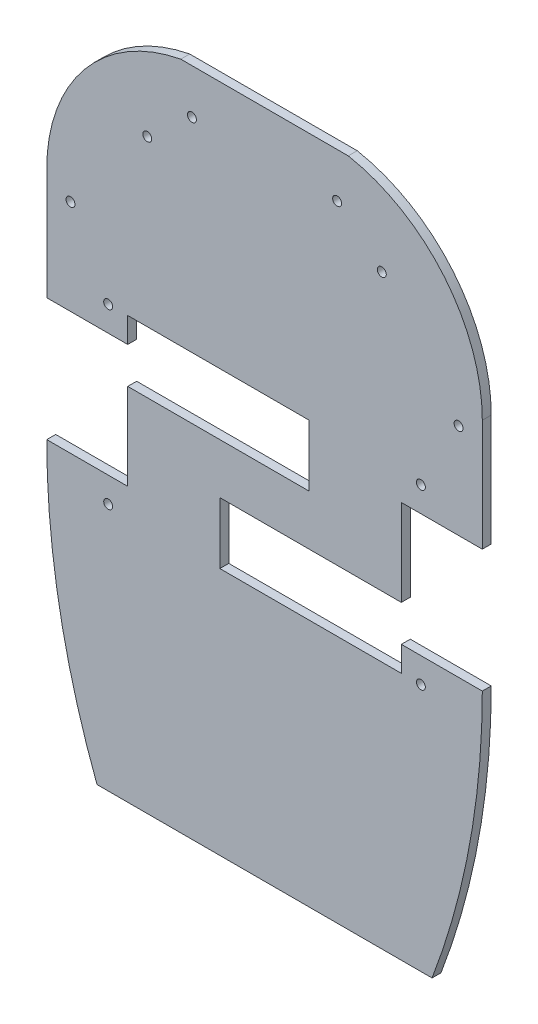
ISO-10303-21;
HEADER;
FILE_DESCRIPTION(('STEP AP214'),'2;1');
FILE_NAME('part.step','',(''),(''),'','','');
FILE_SCHEMA(('AUTOMOTIVE_DESIGN { 1 0 10303 214 1 1 1 1 }'));
ENDSEC;
DATA;
#1=APPLICATION_CONTEXT('core data for automotive mechanical design processes');
#2=APPLICATION_PROTOCOL_DEFINITION('international standard','automotive_design',2000,#1);
#3=PRODUCT_CONTEXT('',#1,'mechanical');
#4=PRODUCT('Part','Part','',(#3));
#5=PRODUCT_RELATED_PRODUCT_CATEGORY('part','',(#4));
#6=PRODUCT_DEFINITION_FORMATION('','',#4);
#7=PRODUCT_DEFINITION_CONTEXT('part definition',#1,'design');
#8=PRODUCT_DEFINITION('design','',#6,#7);
#9=PRODUCT_DEFINITION_SHAPE('','',#8);
#10=(LENGTH_UNIT() NAMED_UNIT(*) SI_UNIT(.MILLI.,.METRE.));
#11=(NAMED_UNIT(*) PLANE_ANGLE_UNIT() SI_UNIT($,.RADIAN.));
#12=(NAMED_UNIT(*) SI_UNIT($,.STERADIAN.) SOLID_ANGLE_UNIT());
#13=UNCERTAINTY_MEASURE_WITH_UNIT(LENGTH_MEASURE(1.E-05),#10,'distance_accuracy_value','');
#14=(GEOMETRIC_REPRESENTATION_CONTEXT(3) GLOBAL_UNCERTAINTY_ASSIGNED_CONTEXT((#13)) GLOBAL_UNIT_ASSIGNED_CONTEXT((#10,
#11,#12)) REPRESENTATION_CONTEXT('',''));
#15=CARTESIAN_POINT('',(0.,0.,0.));
#16=DIRECTION('',(0.,0.,1.));
#17=DIRECTION('',(1.,0.,0.));
#18=AXIS2_PLACEMENT_3D('',#15,#16,#17);
#19=CARTESIAN_POINT('',(-59.8888888888894,49.,1.6));
#20=DIRECTION('',(0.,0.,-1.));
#21=DIRECTION('',(-1.,0.,0.));
#22=AXIS2_PLACEMENT_3D('',#19,#20,#21);
#23=PLANE('',#22);
#24=CARTESIAN_POINT('',(26.,112.,1.6));
#25=DIRECTION('',(0.,0.,1.));
#26=DIRECTION('',(-1.,0.,0.));
#27=AXIS2_PLACEMENT_3D('',#24,#25,#26);
#28=CIRCLE('',#27,0.799999999999994);
#29=CARTESIAN_POINT('',(25.2,112.,1.6));
#30=VERTEX_POINT('',#29);
#31=EDGE_CURVE('E480',#30,#30,#28,.T.);
#32=ORIENTED_EDGE('',*,*,#31,.F.);
#33=EDGE_LOOP('',(#32));
#34=FACE_BOUND('',#33,.T.);
#35=CARTESIAN_POINT('',(18.,105.,1.6));
#36=DIRECTION('',(0.,0.,1.));
#37=DIRECTION('',(-1.,0.,0.));
#38=AXIS2_PLACEMENT_3D('',#35,#36,#37);
#39=CIRCLE('',#38,0.799999999999994);
#40=CARTESIAN_POINT('',(17.2,105.,1.6));
#41=VERTEX_POINT('',#40);
#42=EDGE_CURVE('E468',#41,#41,#39,.T.);
#43=ORIENTED_EDGE('',*,*,#42,.F.);
#44=EDGE_LOOP('',(#43));
#45=FACE_BOUND('',#44,.T.);
#46=CARTESIAN_POINT('',(4.25,88.,1.6));
#47=DIRECTION('',(0.,0.,1.));
#48=DIRECTION('',(-1.,0.,0.));
#49=AXIS2_PLACEMENT_3D('',#46,#47,#48);
#50=CIRCLE('',#49,0.799999999999992);
#51=CARTESIAN_POINT('',(3.45000000000001,88.,1.6));
#52=VERTEX_POINT('',#51);
#53=EDGE_CURVE('E456',#52,#52,#50,.T.);
#54=ORIENTED_EDGE('',*,*,#53,.F.);
#55=EDGE_LOOP('',(#54));
#56=FACE_BOUND('',#55,.T.);
#57=CARTESIAN_POINT('',(11.,44.5,1.6));
#58=DIRECTION('',(0.,0.,1.));
#59=DIRECTION('',(-1.,0.,0.));
#60=AXIS2_PLACEMENT_3D('',#57,#58,#59);
#61=CIRCLE('',#60,0.799999999999996);
#62=CARTESIAN_POINT('',(10.2,44.5,1.6));
#63=VERTEX_POINT('',#62);
#64=EDGE_CURVE('E444',#63,#63,#61,.T.);
#65=ORIENTED_EDGE('',*,*,#64,.F.);
#66=EDGE_LOOP('',(#65));
#67=FACE_BOUND('',#66,.T.);
#68=CARTESIAN_POINT('',(67.,75.5,1.6));
#69=DIRECTION('',(0.,0.,1.));
#70=DIRECTION('',(1.,0.,0.));
#71=AXIS2_PLACEMENT_3D('',#68,#69,#70);
#72=CIRCLE('',#71,0.799999999999994);
#73=CARTESIAN_POINT('',(67.8,75.5,1.6));
#74=VERTEX_POINT('',#73);
#75=EDGE_CURVE('E197',#74,#74,#72,.T.);
#76=ORIENTED_EDGE('',*,*,#75,.F.);
#77=EDGE_LOOP('',(#76));
#78=FACE_BOUND('',#77,.T.);
#79=DIRECTION('',(1.,0.,0.));
#80=VECTOR('',#79,1.);
#81=CARTESIAN_POINT('',(39.,0.,1.6));
#82=LINE('',#81,#80);
#83=CARTESIAN_POINT('',(9.00000000000001,0.,1.6));
#84=VERTEX_POINT('',#83);
#85=CARTESIAN_POINT('',(69.,0.,1.6));
#86=VERTEX_POINT('',#85);
#87=EDGE_CURVE('E45',#84,#86,#82,.T.);
#88=ORIENTED_EDGE('',*,*,#87,.T.);
#89=CARTESIAN_POINT('',(-59.8888888888894,49.,1.6));
#90=DIRECTION('',(0.,0.,1.));
#91=DIRECTION('',(-1.,0.,0.));
#92=AXIS2_PLACEMENT_3D('',#89,#90,#91);
#93=CIRCLE('',#92,137.888888888889);
#94=CARTESIAN_POINT('',(78.,49.,1.6));
#95=VERTEX_POINT('',#94);
#96=EDGE_CURVE('E199',#86,#95,#93,.T.);
#97=ORIENTED_EDGE('',*,*,#96,.T.);
#98=DIRECTION('',(-1.,0.,0.));
#99=VECTOR('',#98,1.);
#100=CARTESIAN_POINT('',(63.5,49.,1.6));
#101=LINE('',#100,#99);
#102=CARTESIAN_POINT('',(63.5,49.,1.6));
#103=VERTEX_POINT('',#102);
#104=EDGE_CURVE('E201',#95,#103,#101,.T.);
#105=ORIENTED_EDGE('',*,*,#104,.T.);
#106=DIRECTION('',(0.,-1.,0.));
#107=VECTOR('',#106,1.);
#108=CARTESIAN_POINT('',(63.5,49.,1.6));
#109=LINE('',#108,#107);
#110=CARTESIAN_POINT('',(63.5,44.5,1.6));
#111=VERTEX_POINT('',#110);
#112=EDGE_CURVE('E210',#103,#111,#109,.T.);
#113=ORIENTED_EDGE('',*,*,#112,.T.);
#114=DIRECTION('',(-1.,0.,0.));
#115=VECTOR('',#114,1.);
#116=CARTESIAN_POINT('',(63.5,44.5,1.6));
#117=LINE('',#116,#115);
#118=CARTESIAN_POINT('',(31.,44.5,1.6));
#119=VERTEX_POINT('',#118);
#120=EDGE_CURVE('E212',#111,#119,#117,.T.);
#121=ORIENTED_EDGE('',*,*,#120,.T.);
#122=DIRECTION('',(0.,1.,0.));
#123=VECTOR('',#122,1.);
#124=CARTESIAN_POINT('',(31.,44.5,1.6));
#125=LINE('',#124,#123);
#126=CARTESIAN_POINT('',(31.,55.5,1.6));
#127=VERTEX_POINT('',#126);
#128=EDGE_CURVE('E214',#119,#127,#125,.T.);
#129=ORIENTED_EDGE('',*,*,#128,.T.);
#130=DIRECTION('',(1.,0.,0.));
#131=VECTOR('',#130,1.);
#132=CARTESIAN_POINT('',(31.,55.5,1.6));
#133=LINE('',#132,#131);
#134=CARTESIAN_POINT('',(63.5,55.5,1.6));
#135=VERTEX_POINT('',#134);
#136=EDGE_CURVE('E216',#127,#135,#133,.T.);
#137=ORIENTED_EDGE('',*,*,#136,.T.);
#138=DIRECTION('',(0.,1.,0.));
#139=VECTOR('',#138,1.);
#140=CARTESIAN_POINT('',(63.5,71.,1.6));
#141=LINE('',#140,#139);
#142=CARTESIAN_POINT('',(63.5,71.,1.6));
#143=VERTEX_POINT('',#142);
#144=EDGE_CURVE('E218',#135,#143,#141,.T.);
#145=ORIENTED_EDGE('',*,*,#144,.T.);
#146=DIRECTION('',(1.,0.,0.));
#147=VECTOR('',#146,1.);
#148=CARTESIAN_POINT('',(78.,71.,1.6));
#149=LINE('',#148,#147);
#150=CARTESIAN_POINT('',(78.,71.,1.6));
#151=VERTEX_POINT('',#150);
#152=EDGE_CURVE('E220',#143,#151,#149,.T.);
#153=ORIENTED_EDGE('',*,*,#152,.T.);
#154=DIRECTION('',(0.,1.,0.));
#155=VECTOR('',#154,1.);
#156=CARTESIAN_POINT('',(78.,91.,1.6));
#157=LINE('',#156,#155);
#158=CARTESIAN_POINT('',(78.,91.,1.6));
#159=VERTEX_POINT('',#158);
#160=EDGE_CURVE('E222',#151,#159,#157,.T.);
#161=ORIENTED_EDGE('',*,*,#160,.T.);
#162=CARTESIAN_POINT('',(48.4791666666667,91.,1.6));
#163=DIRECTION('',(0.,0.,1.));
#164=DIRECTION('',(1.,0.,0.));
#165=AXIS2_PLACEMENT_3D('',#162,#163,#164);
#166=CIRCLE('',#165,29.5208333333333);
#167=CARTESIAN_POINT('',(54.,120.,1.6));
#168=VERTEX_POINT('',#167);
#169=EDGE_CURVE('E224',#159,#168,#166,.T.);
#170=ORIENTED_EDGE('',*,*,#169,.T.);
#171=DIRECTION('',(-1.,0.,0.));
#172=VECTOR('',#171,1.);
#173=CARTESIAN_POINT('',(39.,120.,1.6));
#174=LINE('',#173,#172);
#175=CARTESIAN_POINT('',(24.,120.,1.6));
#176=VERTEX_POINT('',#175);
#177=EDGE_CURVE('E226',#168,#176,#174,.T.);
#178=ORIENTED_EDGE('',*,*,#177,.T.);
#179=CARTESIAN_POINT('',(29.5208333333333,91.,1.6));
#180=DIRECTION('',(0.,0.,1.));
#181=DIRECTION('',(-1.,0.,0.));
#182=AXIS2_PLACEMENT_3D('',#179,#180,#181);
#183=CIRCLE('',#182,29.5208333333333);
#184=CARTESIAN_POINT('',(0.,91.,1.6));
#185=VERTEX_POINT('',#184);
#186=EDGE_CURVE('E228',#176,#185,#183,.T.);
#187=ORIENTED_EDGE('',*,*,#186,.T.);
#188=DIRECTION('',(0.,-1.,0.));
#189=VECTOR('',#188,1.);
#190=CARTESIAN_POINT('',(0.,91.,1.6));
#191=LINE('',#190,#189);
#192=CARTESIAN_POINT('',(0.,71.,1.6));
#193=VERTEX_POINT('',#192);
#194=EDGE_CURVE('E230',#185,#193,#191,.T.);
#195=ORIENTED_EDGE('',*,*,#194,.T.);
#196=DIRECTION('',(1.,0.,0.));
#197=VECTOR('',#196,1.);
#198=CARTESIAN_POINT('',(0.,71.,1.6));
#199=LINE('',#198,#197);
#200=CARTESIAN_POINT('',(14.5,71.,1.6));
#201=VERTEX_POINT('',#200);
#202=EDGE_CURVE('E232',#193,#201,#199,.T.);
#203=ORIENTED_EDGE('',*,*,#202,.T.);
#204=DIRECTION('',(0.,1.,0.));
#205=VECTOR('',#204,1.);
#206=CARTESIAN_POINT('',(14.5,71.,1.6));
#207=LINE('',#206,#205);
#208=CARTESIAN_POINT('',(14.5,75.5,1.6));
#209=VERTEX_POINT('',#208);
#210=EDGE_CURVE('E234',#201,#209,#207,.T.);
#211=ORIENTED_EDGE('',*,*,#210,.T.);
#212=DIRECTION('',(1.,0.,0.));
#213=VECTOR('',#212,1.);
#214=CARTESIAN_POINT('',(14.5,75.5,1.6));
#215=LINE('',#214,#213);
#216=CARTESIAN_POINT('',(47.,75.5,1.6));
#217=VERTEX_POINT('',#216);
#218=EDGE_CURVE('E236',#209,#217,#215,.T.);
#219=ORIENTED_EDGE('',*,*,#218,.T.);
#220=DIRECTION('',(0.,-1.,0.));
#221=VECTOR('',#220,1.);
#222=CARTESIAN_POINT('',(47.,75.5,1.6));
#223=LINE('',#222,#221);
#224=CARTESIAN_POINT('',(47.,64.5,1.6));
#225=VERTEX_POINT('',#224);
#226=EDGE_CURVE('E238',#217,#225,#223,.T.);
#227=ORIENTED_EDGE('',*,*,#226,.T.);
#228=DIRECTION('',(-1.,0.,0.));
#229=VECTOR('',#228,1.);
#230=CARTESIAN_POINT('',(47.,64.5,1.6));
#231=LINE('',#230,#229);
#232=CARTESIAN_POINT('',(14.5,64.5,1.6));
#233=VERTEX_POINT('',#232);
#234=EDGE_CURVE('E240',#225,#233,#231,.T.);
#235=ORIENTED_EDGE('',*,*,#234,.T.);
#236=DIRECTION('',(0.,-1.,0.));
#237=VECTOR('',#236,1.);
#238=CARTESIAN_POINT('',(14.5,64.5,1.6));
#239=LINE('',#238,#237);
#240=CARTESIAN_POINT('',(14.5,49.,1.6));
#241=VERTEX_POINT('',#240);
#242=EDGE_CURVE('E242',#233,#241,#239,.T.);
#243=ORIENTED_EDGE('',*,*,#242,.T.);
#244=DIRECTION('',(-1.,0.,0.));
#245=VECTOR('',#244,1.);
#246=CARTESIAN_POINT('',(14.5,49.,1.6));
#247=LINE('',#246,#245);
#248=CARTESIAN_POINT('',(0.,49.,1.6));
#249=VERTEX_POINT('',#248);
#250=EDGE_CURVE('E52',#241,#249,#247,.T.);
#251=ORIENTED_EDGE('',*,*,#250,.T.);
#252=CARTESIAN_POINT('',(137.888888888888,49.,1.6));
#253=DIRECTION('',(0.,0.,1.));
#254=DIRECTION('',(1.,0.,0.));
#255=AXIS2_PLACEMENT_3D('',#252,#253,#254);
#256=CIRCLE('',#255,137.888888888888);
#257=EDGE_CURVE('E205',#249,#84,#256,.T.);
#258=ORIENTED_EDGE('',*,*,#257,.T.);
#259=EDGE_LOOP('',(#88,#97,#105,#113,#121,#129,#137,#145,#153,#161,#170,#178,#187,#195,#203,
#211,#219,#227,#235,#243,#251,#258));
#260=FACE_BOUND('',#259,.T.);
#261=CARTESIAN_POINT('',(67.,44.5,1.6));
#262=DIRECTION('',(0.,0.,1.));
#263=DIRECTION('',(1.,0.,0.));
#264=AXIS2_PLACEMENT_3D('',#261,#262,#263);
#265=CIRCLE('',#264,0.799999999999996);
#266=CARTESIAN_POINT('',(67.8,44.5,1.6));
#267=VERTEX_POINT('',#266);
#268=EDGE_CURVE('E438',#267,#267,#265,.T.);
#269=ORIENTED_EDGE('',*,*,#268,.F.);
#270=EDGE_LOOP('',(#269));
#271=FACE_BOUND('',#270,.T.);
#272=CARTESIAN_POINT('',(11.,75.5,1.6));
#273=DIRECTION('',(0.,0.,1.));
#274=DIRECTION('',(-1.,0.,0.));
#275=AXIS2_PLACEMENT_3D('',#272,#273,#274);
#276=CIRCLE('',#275,0.799999999999994);
#277=CARTESIAN_POINT('',(10.2,75.5,1.6));
#278=VERTEX_POINT('',#277);
#279=EDGE_CURVE('E450',#278,#278,#276,.T.);
#280=ORIENTED_EDGE('',*,*,#279,.F.);
#281=EDGE_LOOP('',(#280));
#282=FACE_BOUND('',#281,.T.);
#283=CARTESIAN_POINT('',(73.75,88.,1.6));
#284=DIRECTION('',(0.,0.,1.));
#285=DIRECTION('',(-1.,0.,0.));
#286=AXIS2_PLACEMENT_3D('',#283,#284,#285);
#287=CIRCLE('',#286,0.799999999999994);
#288=CARTESIAN_POINT('',(72.95,88.,1.6));
#289=VERTEX_POINT('',#288);
#290=EDGE_CURVE('E462',#289,#289,#287,.T.);
#291=ORIENTED_EDGE('',*,*,#290,.F.);
#292=EDGE_LOOP('',(#291));
#293=FACE_BOUND('',#292,.T.);
#294=CARTESIAN_POINT('',(60.,105.,1.6));
#295=DIRECTION('',(0.,0.,1.));
#296=DIRECTION('',(-1.,0.,0.));
#297=AXIS2_PLACEMENT_3D('',#294,#295,#296);
#298=CIRCLE('',#297,0.799999999999994);
#299=CARTESIAN_POINT('',(59.2,105.,1.6));
#300=VERTEX_POINT('',#299);
#301=EDGE_CURVE('E474',#300,#300,#298,.T.);
#302=ORIENTED_EDGE('',*,*,#301,.F.);
#303=EDGE_LOOP('',(#302));
#304=FACE_BOUND('',#303,.T.);
#305=CARTESIAN_POINT('',(52.,112.,1.6));
#306=DIRECTION('',(0.,0.,1.));
#307=DIRECTION('',(-1.,0.,0.));
#308=AXIS2_PLACEMENT_3D('',#305,#306,#307);
#309=CIRCLE('',#308,0.799999999999994);
#310=CARTESIAN_POINT('',(51.2,112.,1.6));
#311=VERTEX_POINT('',#310);
#312=EDGE_CURVE('E486',#311,#311,#309,.T.);
#313=ORIENTED_EDGE('',*,*,#312,.F.);
#314=EDGE_LOOP('',(#313));
#315=FACE_BOUND('',#314,.T.);
#316=ADVANCED_FACE('F30',(#34,#45,#56,#67,#78,#260,#271,#282,#293,#304,#315),#23,.F.);
#317=CARTESIAN_POINT('',(-59.8888888888894,49.,0.));
#318=DIRECTION('',(0.,0.,-1.));
#319=DIRECTION('',(-1.,0.,0.));
#320=AXIS2_PLACEMENT_3D('',#317,#318,#319);
#321=PLANE('',#320);
#322=CARTESIAN_POINT('',(26.,112.,0.));
#323=DIRECTION('',(0.,0.,1.));
#324=DIRECTION('',(-1.,0.,0.));
#325=AXIS2_PLACEMENT_3D('',#322,#323,#324);
#326=CIRCLE('',#325,0.799999999999994);
#327=CARTESIAN_POINT('',(25.2,112.,0.));
#328=VERTEX_POINT('',#327);
#329=EDGE_CURVE('E483',#328,#328,#326,.T.);
#330=ORIENTED_EDGE('',*,*,#329,.T.);
#331=EDGE_LOOP('',(#330));
#332=FACE_BOUND('',#331,.T.);
#333=CARTESIAN_POINT('',(18.,105.,0.));
#334=DIRECTION('',(0.,0.,1.));
#335=DIRECTION('',(-1.,0.,0.));
#336=AXIS2_PLACEMENT_3D('',#333,#334,#335);
#337=CIRCLE('',#336,0.799999999999994);
#338=CARTESIAN_POINT('',(17.2,105.,0.));
#339=VERTEX_POINT('',#338);
#340=EDGE_CURVE('E471',#339,#339,#337,.T.);
#341=ORIENTED_EDGE('',*,*,#340,.T.);
#342=EDGE_LOOP('',(#341));
#343=FACE_BOUND('',#342,.T.);
#344=CARTESIAN_POINT('',(4.25,88.,0.));
#345=DIRECTION('',(0.,0.,1.));
#346=DIRECTION('',(-1.,0.,0.));
#347=AXIS2_PLACEMENT_3D('',#344,#345,#346);
#348=CIRCLE('',#347,0.799999999999992);
#349=CARTESIAN_POINT('',(3.45000000000001,88.,0.));
#350=VERTEX_POINT('',#349);
#351=EDGE_CURVE('E459',#350,#350,#348,.T.);
#352=ORIENTED_EDGE('',*,*,#351,.T.);
#353=EDGE_LOOP('',(#352));
#354=FACE_BOUND('',#353,.T.);
#355=CARTESIAN_POINT('',(11.,44.5,0.));
#356=DIRECTION('',(0.,0.,1.));
#357=DIRECTION('',(-1.,0.,0.));
#358=AXIS2_PLACEMENT_3D('',#355,#356,#357);
#359=CIRCLE('',#358,0.799999999999996);
#360=CARTESIAN_POINT('',(10.2,44.5,0.));
#361=VERTEX_POINT('',#360);
#362=EDGE_CURVE('E447',#361,#361,#359,.T.);
#363=ORIENTED_EDGE('',*,*,#362,.T.);
#364=EDGE_LOOP('',(#363));
#365=FACE_BOUND('',#364,.T.);
#366=CARTESIAN_POINT('',(67.,75.5,0.));
#367=DIRECTION('',(0.,0.,1.));
#368=DIRECTION('',(1.,0.,0.));
#369=AXIS2_PLACEMENT_3D('',#366,#367,#368);
#370=CIRCLE('',#369,0.799999999999994);
#371=CARTESIAN_POINT('',(67.8,75.5,0.));
#372=VERTEX_POINT('',#371);
#373=EDGE_CURVE('E435',#372,#372,#370,.T.);
#374=ORIENTED_EDGE('',*,*,#373,.T.);
#375=EDGE_LOOP('',(#374));
#376=FACE_BOUND('',#375,.T.);
#377=CARTESIAN_POINT('',(-59.8888888888894,49.,0.));
#378=DIRECTION('',(0.,0.,1.));
#379=DIRECTION('',(-1.,0.,0.));
#380=AXIS2_PLACEMENT_3D('',#377,#378,#379);
#381=CIRCLE('',#380,137.888888888889);
#382=CARTESIAN_POINT('',(69.,0.,0.));
#383=VERTEX_POINT('',#382);
#384=CARTESIAN_POINT('',(78.,49.,0.));
#385=VERTEX_POINT('',#384);
#386=EDGE_CURVE('E189',#383,#385,#381,.T.);
#387=ORIENTED_EDGE('',*,*,#386,.F.);
#388=DIRECTION('',(1.,0.,0.));
#389=VECTOR('',#388,1.);
#390=CARTESIAN_POINT('',(39.,0.,0.));
#391=LINE('',#390,#389);
#392=CARTESIAN_POINT('',(9.00000000000001,0.,0.));
#393=VERTEX_POINT('',#392);
#394=EDGE_CURVE('E179',#393,#383,#391,.T.);
#395=ORIENTED_EDGE('',*,*,#394,.F.);
#396=CARTESIAN_POINT('',(137.888888888888,49.,0.));
#397=DIRECTION('',(0.,0.,1.));
#398=DIRECTION('',(1.,0.,0.));
#399=AXIS2_PLACEMENT_3D('',#396,#397,#398);
#400=CIRCLE('',#399,137.888888888888);
#401=CARTESIAN_POINT('',(0.,49.,0.));
#402=VERTEX_POINT('',#401);
#403=EDGE_CURVE('E186',#402,#393,#400,.T.);
#404=ORIENTED_EDGE('',*,*,#403,.F.);
#405=DIRECTION('',(-1.,0.,0.));
#406=VECTOR('',#405,1.);
#407=CARTESIAN_POINT('',(14.5,49.,0.));
#408=LINE('',#407,#406);
#409=CARTESIAN_POINT('',(14.5,49.,0.));
#410=VERTEX_POINT('',#409);
#411=EDGE_CURVE('E405',#410,#402,#408,.T.);
#412=ORIENTED_EDGE('',*,*,#411,.F.);
#413=DIRECTION('',(0.,-1.,0.));
#414=VECTOR('',#413,1.);
#415=CARTESIAN_POINT('',(14.5,64.5,0.));
#416=LINE('',#415,#414);
#417=CARTESIAN_POINT('',(14.5,64.5,0.));
#418=VERTEX_POINT('',#417);
#419=EDGE_CURVE('E401',#418,#410,#416,.T.);
#420=ORIENTED_EDGE('',*,*,#419,.F.);
#421=DIRECTION('',(-1.,0.,0.));
#422=VECTOR('',#421,1.);
#423=CARTESIAN_POINT('',(47.,64.5,0.));
#424=LINE('',#423,#422);
#425=CARTESIAN_POINT('',(47.,64.5,0.));
#426=VERTEX_POINT('',#425);
#427=EDGE_CURVE('E397',#426,#418,#424,.T.);
#428=ORIENTED_EDGE('',*,*,#427,.F.);
#429=DIRECTION('',(0.,-1.,0.));
#430=VECTOR('',#429,1.);
#431=CARTESIAN_POINT('',(47.,75.5,0.));
#432=LINE('',#431,#430);
#433=CARTESIAN_POINT('',(47.,75.5,0.));
#434=VERTEX_POINT('',#433);
#435=EDGE_CURVE('E412',#434,#426,#432,.T.);
#436=ORIENTED_EDGE('',*,*,#435,.F.);
#437=DIRECTION('',(1.,0.,0.));
#438=VECTOR('',#437,1.);
#439=CARTESIAN_POINT('',(14.5,75.5,0.));
#440=LINE('',#439,#438);
#441=CARTESIAN_POINT('',(14.5,75.5,0.));
#442=VERTEX_POINT('',#441);
#443=EDGE_CURVE('E385',#442,#434,#440,.T.);
#444=ORIENTED_EDGE('',*,*,#443,.F.);
#445=DIRECTION('',(0.,1.,0.));
#446=VECTOR('',#445,1.);
#447=CARTESIAN_POINT('',(14.5,71.,0.));
#448=LINE('',#447,#446);
#449=CARTESIAN_POINT('',(14.5,71.,0.));
#450=VERTEX_POINT('',#449);
#451=EDGE_CURVE('E380',#450,#442,#448,.T.);
#452=ORIENTED_EDGE('',*,*,#451,.F.);
#453=DIRECTION('',(1.,0.,0.));
#454=VECTOR('',#453,1.);
#455=CARTESIAN_POINT('',(0.,71.,0.));
#456=LINE('',#455,#454);
#457=CARTESIAN_POINT('',(0.,71.,0.));
#458=VERTEX_POINT('',#457);
#459=EDGE_CURVE('E416',#458,#450,#456,.T.);
#460=ORIENTED_EDGE('',*,*,#459,.F.);
#461=DIRECTION('',(0.,-1.,0.));
#462=VECTOR('',#461,1.);
#463=CARTESIAN_POINT('',(0.,91.,0.));
#464=LINE('',#463,#462);
#465=CARTESIAN_POINT('',(0.,91.,0.));
#466=VERTEX_POINT('',#465);
#467=EDGE_CURVE('E368',#466,#458,#464,.T.);
#468=ORIENTED_EDGE('',*,*,#467,.F.);
#469=CARTESIAN_POINT('',(29.5208333333333,91.,0.));
#470=DIRECTION('',(0.,0.,1.));
#471=DIRECTION('',(-1.,0.,0.));
#472=AXIS2_PLACEMENT_3D('',#469,#470,#471);
#473=CIRCLE('',#472,29.5208333333333);
#474=CARTESIAN_POINT('',(24.,120.,0.));
#475=VERTEX_POINT('',#474);
#476=EDGE_CURVE('E363',#475,#466,#473,.T.);
#477=ORIENTED_EDGE('',*,*,#476,.F.);
#478=DIRECTION('',(-1.,0.,0.));
#479=VECTOR('',#478,1.);
#480=CARTESIAN_POINT('',(39.,120.,0.));
#481=LINE('',#480,#479);
#482=CARTESIAN_POINT('',(54.,120.,0.));
#483=VERTEX_POINT('',#482);
#484=EDGE_CURVE('E420',#483,#475,#481,.T.);
#485=ORIENTED_EDGE('',*,*,#484,.F.);
#486=CARTESIAN_POINT('',(48.4791666666667,91.,0.));
#487=DIRECTION('',(0.,0.,1.));
#488=DIRECTION('',(1.,0.,0.));
#489=AXIS2_PLACEMENT_3D('',#486,#487,#488);
#490=CIRCLE('',#489,29.5208333333333);
#491=CARTESIAN_POINT('',(78.,91.,0.));
#492=VERTEX_POINT('',#491);
#493=EDGE_CURVE('E352',#492,#483,#490,.T.);
#494=ORIENTED_EDGE('',*,*,#493,.F.);
#495=DIRECTION('',(0.,1.,0.));
#496=VECTOR('',#495,1.);
#497=CARTESIAN_POINT('',(78.,91.,0.));
#498=LINE('',#497,#496);
#499=CARTESIAN_POINT('',(78.,71.,0.));
#500=VERTEX_POINT('',#499);
#501=EDGE_CURVE('E346',#500,#492,#498,.T.);
#502=ORIENTED_EDGE('',*,*,#501,.F.);
#503=DIRECTION('',(1.,0.,0.));
#504=VECTOR('',#503,1.);
#505=CARTESIAN_POINT('',(78.,71.,0.));
#506=LINE('',#505,#504);
#507=CARTESIAN_POINT('',(63.5,71.,0.));
#508=VERTEX_POINT('',#507);
#509=EDGE_CURVE('E424',#508,#500,#506,.T.);
#510=ORIENTED_EDGE('',*,*,#509,.F.);
#511=DIRECTION('',(0.,1.,0.));
#512=VECTOR('',#511,1.);
#513=CARTESIAN_POINT('',(63.5,71.,0.));
#514=LINE('',#513,#512);
#515=CARTESIAN_POINT('',(63.5,55.5,0.));
#516=VERTEX_POINT('',#515);
#517=EDGE_CURVE('E334',#516,#508,#514,.T.);
#518=ORIENTED_EDGE('',*,*,#517,.F.);
#519=DIRECTION('',(1.,0.,0.));
#520=VECTOR('',#519,1.);
#521=CARTESIAN_POINT('',(31.,55.5,0.));
#522=LINE('',#521,#520);
#523=CARTESIAN_POINT('',(31.,55.5,0.));
#524=VERTEX_POINT('',#523);
#525=EDGE_CURVE('E329',#524,#516,#522,.T.);
#526=ORIENTED_EDGE('',*,*,#525,.F.);
#527=DIRECTION('',(0.,1.,0.));
#528=VECTOR('',#527,1.);
#529=CARTESIAN_POINT('',(31.,44.5,0.));
#530=LINE('',#529,#528);
#531=CARTESIAN_POINT('',(31.,44.5,0.));
#532=VERTEX_POINT('',#531);
#533=EDGE_CURVE('E428',#532,#524,#530,.T.);
#534=ORIENTED_EDGE('',*,*,#533,.F.);
#535=DIRECTION('',(-1.,0.,0.));
#536=VECTOR('',#535,1.);
#537=CARTESIAN_POINT('',(63.5,44.5,0.));
#538=LINE('',#537,#536);
#539=CARTESIAN_POINT('',(63.5,44.5,0.));
#540=VERTEX_POINT('',#539);
#541=EDGE_CURVE('E317',#540,#532,#538,.T.);
#542=ORIENTED_EDGE('',*,*,#541,.F.);
#543=DIRECTION('',(0.,-1.,0.));
#544=VECTOR('',#543,1.);
#545=CARTESIAN_POINT('',(63.5,49.,0.));
#546=LINE('',#545,#544);
#547=CARTESIAN_POINT('',(63.5,49.,0.));
#548=VERTEX_POINT('',#547);
#549=EDGE_CURVE('E312',#548,#540,#546,.T.);
#550=ORIENTED_EDGE('',*,*,#549,.F.);
#551=DIRECTION('',(-1.,0.,0.));
#552=VECTOR('',#551,1.);
#553=CARTESIAN_POINT('',(63.5,49.,0.));
#554=LINE('',#553,#552);
#555=EDGE_CURVE('E193',#385,#548,#554,.T.);
#556=ORIENTED_EDGE('',*,*,#555,.F.);
#557=EDGE_LOOP('',(#387,#395,#404,#412,#420,#428,#436,#444,#452,#460,#468,#477,#485,#494,#502,
#510,#518,#526,#534,#542,#550,#556));
#558=FACE_BOUND('',#557,.T.);
#559=CARTESIAN_POINT('',(67.,44.5,0.));
#560=DIRECTION('',(0.,0.,1.));
#561=DIRECTION('',(1.,0.,0.));
#562=AXIS2_PLACEMENT_3D('',#559,#560,#561);
#563=CIRCLE('',#562,0.799999999999996);
#564=CARTESIAN_POINT('',(67.8,44.5,0.));
#565=VERTEX_POINT('',#564);
#566=EDGE_CURVE('E441',#565,#565,#563,.T.);
#567=ORIENTED_EDGE('',*,*,#566,.T.);
#568=EDGE_LOOP('',(#567));
#569=FACE_BOUND('',#568,.T.);
#570=CARTESIAN_POINT('',(11.,75.5,0.));
#571=DIRECTION('',(0.,0.,1.));
#572=DIRECTION('',(-1.,0.,0.));
#573=AXIS2_PLACEMENT_3D('',#570,#571,#572);
#574=CIRCLE('',#573,0.799999999999994);
#575=CARTESIAN_POINT('',(10.2,75.5,0.));
#576=VERTEX_POINT('',#575);
#577=EDGE_CURVE('E453',#576,#576,#574,.T.);
#578=ORIENTED_EDGE('',*,*,#577,.T.);
#579=EDGE_LOOP('',(#578));
#580=FACE_BOUND('',#579,.T.);
#581=CARTESIAN_POINT('',(73.75,88.,0.));
#582=DIRECTION('',(0.,0.,1.));
#583=DIRECTION('',(-1.,0.,0.));
#584=AXIS2_PLACEMENT_3D('',#581,#582,#583);
#585=CIRCLE('',#584,0.799999999999994);
#586=CARTESIAN_POINT('',(72.95,88.,0.));
#587=VERTEX_POINT('',#586);
#588=EDGE_CURVE('E465',#587,#587,#585,.T.);
#589=ORIENTED_EDGE('',*,*,#588,.T.);
#590=EDGE_LOOP('',(#589));
#591=FACE_BOUND('',#590,.T.);
#592=CARTESIAN_POINT('',(60.,105.,0.));
#593=DIRECTION('',(0.,0.,1.));
#594=DIRECTION('',(-1.,0.,0.));
#595=AXIS2_PLACEMENT_3D('',#592,#593,#594);
#596=CIRCLE('',#595,0.799999999999994);
#597=CARTESIAN_POINT('',(59.2,105.,0.));
#598=VERTEX_POINT('',#597);
#599=EDGE_CURVE('E477',#598,#598,#596,.T.);
#600=ORIENTED_EDGE('',*,*,#599,.T.);
#601=EDGE_LOOP('',(#600));
#602=FACE_BOUND('',#601,.T.);
#603=CARTESIAN_POINT('',(52.,112.,0.));
#604=DIRECTION('',(0.,0.,1.));
#605=DIRECTION('',(-1.,0.,0.));
#606=AXIS2_PLACEMENT_3D('',#603,#604,#605);
#607=CIRCLE('',#606,0.799999999999994);
#608=CARTESIAN_POINT('',(51.2,112.,0.));
#609=VERTEX_POINT('',#608);
#610=EDGE_CURVE('E489',#609,#609,#607,.T.);
#611=ORIENTED_EDGE('',*,*,#610,.T.);
#612=EDGE_LOOP('',(#611));
#613=FACE_BOUND('',#612,.T.);
#614=ADVANCED_FACE('F190',(#332,#343,#354,#365,#376,#558,#569,#580,#591,#602,#613),#321,.T.);
#615=CARTESIAN_POINT('',(-59.8888888888894,49.,1.6));
#616=DIRECTION('',(0.,0.,-1.));
#617=DIRECTION('',(-1.,0.,0.));
#618=AXIS2_PLACEMENT_3D('',#615,#616,#617);
#619=CYLINDRICAL_SURFACE('',#618,137.888888888889);
#620=ORIENTED_EDGE('',*,*,#386,.T.);
#621=DIRECTION('',(0.,0.,-1.));
#622=VECTOR('',#621,1.);
#623=CARTESIAN_POINT('',(78.,49.,1.6));
#624=LINE('',#623,#622);
#625=EDGE_CURVE('E38',#95,#385,#624,.T.);
#626=ORIENTED_EDGE('',*,*,#625,.F.);
#627=ORIENTED_EDGE('',*,*,#96,.F.);
#628=DIRECTION('',(0.,0.,-1.));
#629=VECTOR('',#628,1.);
#630=CARTESIAN_POINT('',(69.,0.,1.6));
#631=LINE('',#630,#629);
#632=EDGE_CURVE('E11',#86,#383,#631,.T.);
#633=ORIENTED_EDGE('',*,*,#632,.T.);
#634=EDGE_LOOP('',(#620,#626,#627,#633));
#635=FACE_BOUND('',#634,.T.);
#636=ADVANCED_FACE('F32',(#635),#619,.T.);
#637=CARTESIAN_POINT('',(63.5,49.,1.6));
#638=DIRECTION('',(0.,-1.,0.));
#639=DIRECTION('',(0.,0.,-1.));
#640=AXIS2_PLACEMENT_3D('',#637,#638,#639);
#641=PLANE('',#640);
#642=ORIENTED_EDGE('',*,*,#555,.T.);
#643=DIRECTION('',(0.,0.,-1.));
#644=VECTOR('',#643,1.);
#645=CARTESIAN_POINT('',(63.5,49.,1.6));
#646=LINE('',#645,#644);
#647=EDGE_CURVE('E301',#103,#548,#646,.T.);
#648=ORIENTED_EDGE('',*,*,#647,.F.);
#649=ORIENTED_EDGE('',*,*,#104,.F.);
#650=ORIENTED_EDGE('',*,*,#625,.T.);
#651=EDGE_LOOP('',(#642,#648,#649,#650));
#652=FACE_BOUND('',#651,.T.);
#653=ADVANCED_FACE('F304',(#652),#641,.F.);
#654=CARTESIAN_POINT('',(63.5,49.,1.6));
#655=DIRECTION('',(1.,0.,0.));
#656=DIRECTION('',(0.,0.,-1.));
#657=AXIS2_PLACEMENT_3D('',#654,#655,#656);
#658=PLANE('',#657);
#659=ORIENTED_EDGE('',*,*,#549,.T.);
#660=DIRECTION('',(0.,0.,-1.));
#661=VECTOR('',#660,1.);
#662=CARTESIAN_POINT('',(63.5,44.5,1.6));
#663=LINE('',#662,#661);
#664=EDGE_CURVE('E298',#111,#540,#663,.T.);
#665=ORIENTED_EDGE('',*,*,#664,.F.);
#666=ORIENTED_EDGE('',*,*,#112,.F.);
#667=ORIENTED_EDGE('',*,*,#647,.T.);
#668=EDGE_LOOP('',(#659,#665,#666,#667));
#669=FACE_BOUND('',#668,.T.);
#670=ADVANCED_FACE('F311',(#669),#658,.F.);
#671=CARTESIAN_POINT('',(63.5,44.5,1.6));
#672=DIRECTION('',(0.,-1.,0.));
#673=DIRECTION('',(0.,0.,-1.));
#674=AXIS2_PLACEMENT_3D('',#671,#672,#673);
#675=PLANE('',#674);
#676=ORIENTED_EDGE('',*,*,#541,.T.);
#677=DIRECTION('',(0.,0.,-1.));
#678=VECTOR('',#677,1.);
#679=CARTESIAN_POINT('',(31.,44.5,1.6));
#680=LINE('',#679,#678);
#681=EDGE_CURVE('E295',#119,#532,#680,.T.);
#682=ORIENTED_EDGE('',*,*,#681,.F.);
#683=ORIENTED_EDGE('',*,*,#120,.F.);
#684=ORIENTED_EDGE('',*,*,#664,.T.);
#685=EDGE_LOOP('',(#676,#682,#683,#684));
#686=FACE_BOUND('',#685,.T.);
#687=ADVANCED_FACE('F315',(#686),#675,.F.);
#688=CARTESIAN_POINT('',(31.,44.5,1.6));
#689=DIRECTION('',(-1.,0.,0.));
#690=DIRECTION('',(0.,0.,1.));
#691=AXIS2_PLACEMENT_3D('',#688,#689,#690);
#692=PLANE('',#691);
#693=ORIENTED_EDGE('',*,*,#533,.T.);
#694=DIRECTION('',(0.,0.,-1.));
#695=VECTOR('',#694,1.);
#696=CARTESIAN_POINT('',(31.,55.5,1.6));
#697=LINE('',#696,#695);
#698=EDGE_CURVE('E292',#127,#524,#697,.T.);
#699=ORIENTED_EDGE('',*,*,#698,.F.);
#700=ORIENTED_EDGE('',*,*,#128,.F.);
#701=ORIENTED_EDGE('',*,*,#681,.T.);
#702=EDGE_LOOP('',(#693,#699,#700,#701));
#703=FACE_BOUND('',#702,.T.);
#704=ADVANCED_FACE('F321',(#703),#692,.F.);
#705=CARTESIAN_POINT('',(31.,55.5,1.6));
#706=DIRECTION('',(0.,1.,0.));
#707=DIRECTION('',(0.,0.,1.));
#708=AXIS2_PLACEMENT_3D('',#705,#706,#707);
#709=PLANE('',#708);
#710=ORIENTED_EDGE('',*,*,#525,.T.);
#711=DIRECTION('',(0.,0.,-1.));
#712=VECTOR('',#711,1.);
#713=CARTESIAN_POINT('',(63.5,55.5,1.6));
#714=LINE('',#713,#712);
#715=EDGE_CURVE('E289',#135,#516,#714,.T.);
#716=ORIENTED_EDGE('',*,*,#715,.F.);
#717=ORIENTED_EDGE('',*,*,#136,.F.);
#718=ORIENTED_EDGE('',*,*,#698,.T.);
#719=EDGE_LOOP('',(#710,#716,#717,#718));
#720=FACE_BOUND('',#719,.T.);
#721=ADVANCED_FACE('F327',(#720),#709,.F.);
#722=CARTESIAN_POINT('',(63.5,71.,1.6));
#723=DIRECTION('',(-1.,0.,0.));
#724=DIRECTION('',(0.,0.,1.));
#725=AXIS2_PLACEMENT_3D('',#722,#723,#724);
#726=PLANE('',#725);
#727=ORIENTED_EDGE('',*,*,#517,.T.);
#728=DIRECTION('',(0.,0.,-1.));
#729=VECTOR('',#728,1.);
#730=CARTESIAN_POINT('',(63.5,71.,1.6));
#731=LINE('',#730,#729);
#732=EDGE_CURVE('E286',#143,#508,#731,.T.);
#733=ORIENTED_EDGE('',*,*,#732,.F.);
#734=ORIENTED_EDGE('',*,*,#144,.F.);
#735=ORIENTED_EDGE('',*,*,#715,.T.);
#736=EDGE_LOOP('',(#727,#733,#734,#735));
#737=FACE_BOUND('',#736,.T.);
#738=ADVANCED_FACE('F332',(#737),#726,.F.);
#739=CARTESIAN_POINT('',(78.,71.,1.6));
#740=DIRECTION('',(0.,1.,0.));
#741=DIRECTION('',(0.,0.,1.));
#742=AXIS2_PLACEMENT_3D('',#739,#740,#741);
#743=PLANE('',#742);
#744=ORIENTED_EDGE('',*,*,#509,.T.);
#745=DIRECTION('',(0.,0.,-1.));
#746=VECTOR('',#745,1.);
#747=CARTESIAN_POINT('',(78.,71.,1.6));
#748=LINE('',#747,#746);
#749=EDGE_CURVE('E283',#151,#500,#748,.T.);
#750=ORIENTED_EDGE('',*,*,#749,.F.);
#751=ORIENTED_EDGE('',*,*,#152,.F.);
#752=ORIENTED_EDGE('',*,*,#732,.T.);
#753=EDGE_LOOP('',(#744,#750,#751,#752));
#754=FACE_BOUND('',#753,.T.);
#755=ADVANCED_FACE('F338',(#754),#743,.F.);
#756=CARTESIAN_POINT('',(78.,91.,1.6));
#757=DIRECTION('',(-1.,0.,0.));
#758=DIRECTION('',(0.,-1.,0.));
#759=AXIS2_PLACEMENT_3D('',#756,#757,#758);
#760=PLANE('',#759);
#761=ORIENTED_EDGE('',*,*,#501,.T.);
#762=DIRECTION('',(0.,0.,-1.));
#763=VECTOR('',#762,1.);
#764=CARTESIAN_POINT('',(78.,91.,1.6));
#765=LINE('',#764,#763);
#766=EDGE_CURVE('E280',#159,#492,#765,.T.);
#767=ORIENTED_EDGE('',*,*,#766,.F.);
#768=ORIENTED_EDGE('',*,*,#160,.F.);
#769=ORIENTED_EDGE('',*,*,#749,.T.);
#770=EDGE_LOOP('',(#761,#767,#768,#769));
#771=FACE_BOUND('',#770,.T.);
#772=ADVANCED_FACE('F344',(#771),#760,.F.);
#773=CARTESIAN_POINT('',(48.4791666666667,91.,1.6));
#774=DIRECTION('',(0.,0.,-1.));
#775=DIRECTION('',(-1.,0.,0.));
#776=AXIS2_PLACEMENT_3D('',#773,#774,#775);
#777=CYLINDRICAL_SURFACE('',#776,29.5208333333333);
#778=ORIENTED_EDGE('',*,*,#493,.T.);
#779=DIRECTION('',(0.,0.,-1.));
#780=VECTOR('',#779,1.);
#781=CARTESIAN_POINT('',(54.,120.,1.6));
#782=LINE('',#781,#780);
#783=EDGE_CURVE('E277',#168,#483,#782,.T.);
#784=ORIENTED_EDGE('',*,*,#783,.F.);
#785=ORIENTED_EDGE('',*,*,#169,.F.);
#786=ORIENTED_EDGE('',*,*,#766,.T.);
#787=EDGE_LOOP('',(#778,#784,#785,#786));
#788=FACE_BOUND('',#787,.T.);
#789=ADVANCED_FACE('F350',(#788),#777,.T.);
#790=CARTESIAN_POINT('',(39.,120.,1.6));
#791=DIRECTION('',(0.,-1.,0.));
#792=DIRECTION('',(0.,0.,-1.));
#793=AXIS2_PLACEMENT_3D('',#790,#791,#792);
#794=PLANE('',#793);
#795=ORIENTED_EDGE('',*,*,#484,.T.);
#796=DIRECTION('',(0.,0.,-1.));
#797=VECTOR('',#796,1.);
#798=CARTESIAN_POINT('',(24.,120.,1.6));
#799=LINE('',#798,#797);
#800=EDGE_CURVE('E274',#176,#475,#799,.T.);
#801=ORIENTED_EDGE('',*,*,#800,.F.);
#802=ORIENTED_EDGE('',*,*,#177,.F.);
#803=ORIENTED_EDGE('',*,*,#783,.T.);
#804=EDGE_LOOP('',(#795,#801,#802,#803));
#805=FACE_BOUND('',#804,.T.);
#806=ADVANCED_FACE('F355',(#805),#794,.F.);
#807=CARTESIAN_POINT('',(29.5208333333333,91.,1.6));
#808=DIRECTION('',(0.,0.,-1.));
#809=DIRECTION('',(-1.,0.,0.));
#810=AXIS2_PLACEMENT_3D('',#807,#808,#809);
#811=CYLINDRICAL_SURFACE('',#810,29.5208333333333);
#812=ORIENTED_EDGE('',*,*,#476,.T.);
#813=DIRECTION('',(0.,0.,-1.));
#814=VECTOR('',#813,1.);
#815=CARTESIAN_POINT('',(0.,91.,1.6));
#816=LINE('',#815,#814);
#817=EDGE_CURVE('E271',#185,#466,#816,.T.);
#818=ORIENTED_EDGE('',*,*,#817,.F.);
#819=ORIENTED_EDGE('',*,*,#186,.F.);
#820=ORIENTED_EDGE('',*,*,#800,.T.);
#821=EDGE_LOOP('',(#812,#818,#819,#820));
#822=FACE_BOUND('',#821,.T.);
#823=ADVANCED_FACE('F361',(#822),#811,.T.);
#824=CARTESIAN_POINT('',(0.,91.,1.6));
#825=DIRECTION('',(1.,0.,0.));
#826=DIRECTION('',(0.,1.,0.));
#827=AXIS2_PLACEMENT_3D('',#824,#825,#826);
#828=PLANE('',#827);
#829=ORIENTED_EDGE('',*,*,#467,.T.);
#830=DIRECTION('',(0.,0.,-1.));
#831=VECTOR('',#830,1.);
#832=CARTESIAN_POINT('',(0.,71.,1.6));
#833=LINE('',#832,#831);
#834=EDGE_CURVE('E268',#193,#458,#833,.T.);
#835=ORIENTED_EDGE('',*,*,#834,.F.);
#836=ORIENTED_EDGE('',*,*,#194,.F.);
#837=ORIENTED_EDGE('',*,*,#817,.T.);
#838=EDGE_LOOP('',(#829,#835,#836,#837));
#839=FACE_BOUND('',#838,.T.);
#840=ADVANCED_FACE('F366',(#839),#828,.F.);
#841=CARTESIAN_POINT('',(0.,71.,1.6));
#842=DIRECTION('',(0.,1.,0.));
#843=DIRECTION('',(0.,0.,1.));
#844=AXIS2_PLACEMENT_3D('',#841,#842,#843);
#845=PLANE('',#844);
#846=ORIENTED_EDGE('',*,*,#459,.T.);
#847=DIRECTION('',(0.,0.,-1.));
#848=VECTOR('',#847,1.);
#849=CARTESIAN_POINT('',(14.5,71.,1.6));
#850=LINE('',#849,#848);
#851=EDGE_CURVE('E265',#201,#450,#850,.T.);
#852=ORIENTED_EDGE('',*,*,#851,.F.);
#853=ORIENTED_EDGE('',*,*,#202,.F.);
#854=ORIENTED_EDGE('',*,*,#834,.T.);
#855=EDGE_LOOP('',(#846,#852,#853,#854));
#856=FACE_BOUND('',#855,.T.);
#857=ADVANCED_FACE('F372',(#856),#845,.F.);
#858=CARTESIAN_POINT('',(14.5,71.,1.6));
#859=DIRECTION('',(-1.,0.,0.));
#860=DIRECTION('',(0.,-1.,0.));
#861=AXIS2_PLACEMENT_3D('',#858,#859,#860);
#862=PLANE('',#861);
#863=ORIENTED_EDGE('',*,*,#451,.T.);
#864=DIRECTION('',(0.,0.,-1.));
#865=VECTOR('',#864,1.);
#866=CARTESIAN_POINT('',(14.5,75.5,1.6));
#867=LINE('',#866,#865);
#868=EDGE_CURVE('E262',#209,#442,#867,.T.);
#869=ORIENTED_EDGE('',*,*,#868,.F.);
#870=ORIENTED_EDGE('',*,*,#210,.F.);
#871=ORIENTED_EDGE('',*,*,#851,.T.);
#872=EDGE_LOOP('',(#863,#869,#870,#871));
#873=FACE_BOUND('',#872,.T.);
#874=ADVANCED_FACE('F378',(#873),#862,.F.);
#875=CARTESIAN_POINT('',(14.5,75.5,1.6));
#876=DIRECTION('',(0.,1.,0.));
#877=DIRECTION('',(0.,0.,1.));
#878=AXIS2_PLACEMENT_3D('',#875,#876,#877);
#879=PLANE('',#878);
#880=ORIENTED_EDGE('',*,*,#443,.T.);
#881=DIRECTION('',(0.,0.,-1.));
#882=VECTOR('',#881,1.);
#883=CARTESIAN_POINT('',(47.,75.5,1.6));
#884=LINE('',#883,#882);
#885=EDGE_CURVE('E259',#217,#434,#884,.T.);
#886=ORIENTED_EDGE('',*,*,#885,.F.);
#887=ORIENTED_EDGE('',*,*,#218,.F.);
#888=ORIENTED_EDGE('',*,*,#868,.T.);
#889=EDGE_LOOP('',(#880,#886,#887,#888));
#890=FACE_BOUND('',#889,.T.);
#891=ADVANCED_FACE('F383',(#890),#879,.F.);
#892=CARTESIAN_POINT('',(47.,75.5,1.6));
#893=DIRECTION('',(1.,0.,0.));
#894=DIRECTION('',(0.,0.,-1.));
#895=AXIS2_PLACEMENT_3D('',#892,#893,#894);
#896=PLANE('',#895);
#897=ORIENTED_EDGE('',*,*,#435,.T.);
#898=DIRECTION('',(0.,0.,-1.));
#899=VECTOR('',#898,1.);
#900=CARTESIAN_POINT('',(47.,64.5,1.6));
#901=LINE('',#900,#899);
#902=EDGE_CURVE('E256',#225,#426,#901,.T.);
#903=ORIENTED_EDGE('',*,*,#902,.F.);
#904=ORIENTED_EDGE('',*,*,#226,.F.);
#905=ORIENTED_EDGE('',*,*,#885,.T.);
#906=EDGE_LOOP('',(#897,#903,#904,#905));
#907=FACE_BOUND('',#906,.T.);
#908=ADVANCED_FACE('F389',(#907),#896,.F.);
#909=CARTESIAN_POINT('',(47.,64.5,1.6));
#910=DIRECTION('',(0.,-1.,0.));
#911=DIRECTION('',(0.,0.,-1.));
#912=AXIS2_PLACEMENT_3D('',#909,#910,#911);
#913=PLANE('',#912);
#914=ORIENTED_EDGE('',*,*,#427,.T.);
#915=DIRECTION('',(0.,0.,-1.));
#916=VECTOR('',#915,1.);
#917=CARTESIAN_POINT('',(14.5,64.5,1.6));
#918=LINE('',#917,#916);
#919=EDGE_CURVE('E253',#233,#418,#918,.T.);
#920=ORIENTED_EDGE('',*,*,#919,.F.);
#921=ORIENTED_EDGE('',*,*,#234,.F.);
#922=ORIENTED_EDGE('',*,*,#902,.T.);
#923=EDGE_LOOP('',(#914,#920,#921,#922));
#924=FACE_BOUND('',#923,.T.);
#925=ADVANCED_FACE('F395',(#924),#913,.F.);
#926=CARTESIAN_POINT('',(14.5,64.5,1.6));
#927=DIRECTION('',(1.,0.,0.));
#928=DIRECTION('',(0.,1.,0.));
#929=AXIS2_PLACEMENT_3D('',#926,#927,#928);
#930=PLANE('',#929);
#931=ORIENTED_EDGE('',*,*,#419,.T.);
#932=DIRECTION('',(0.,0.,-1.));
#933=VECTOR('',#932,1.);
#934=CARTESIAN_POINT('',(14.5,49.,1.6));
#935=LINE('',#934,#933);
#936=EDGE_CURVE('E250',#241,#410,#935,.T.);
#937=ORIENTED_EDGE('',*,*,#936,.F.);
#938=ORIENTED_EDGE('',*,*,#242,.F.);
#939=ORIENTED_EDGE('',*,*,#919,.T.);
#940=EDGE_LOOP('',(#931,#937,#938,#939));
#941=FACE_BOUND('',#940,.T.);
#942=ADVANCED_FACE('F400',(#941),#930,.F.);
#943=CARTESIAN_POINT('',(14.5,49.,1.6));
#944=DIRECTION('',(0.,-1.,0.));
#945=DIRECTION('',(0.,0.,-1.));
#946=AXIS2_PLACEMENT_3D('',#943,#944,#945);
#947=PLANE('',#946);
#948=ORIENTED_EDGE('',*,*,#411,.T.);
#949=DIRECTION('',(0.,0.,-1.));
#950=VECTOR('',#949,1.);
#951=CARTESIAN_POINT('',(0.,49.,1.6));
#952=LINE('',#951,#950);
#953=EDGE_CURVE('E247',#249,#402,#952,.T.);
#954=ORIENTED_EDGE('',*,*,#953,.F.);
#955=ORIENTED_EDGE('',*,*,#250,.F.);
#956=ORIENTED_EDGE('',*,*,#936,.T.);
#957=EDGE_LOOP('',(#948,#954,#955,#956));
#958=FACE_BOUND('',#957,.T.);
#959=ADVANCED_FACE('F404',(#958),#947,.F.);
#960=CARTESIAN_POINT('',(137.888888888888,49.,1.6));
#961=DIRECTION('',(0.,0.,-1.));
#962=DIRECTION('',(-1.,0.,0.));
#963=AXIS2_PLACEMENT_3D('',#960,#961,#962);
#964=CYLINDRICAL_SURFACE('',#963,137.888888888888);
#965=ORIENTED_EDGE('',*,*,#403,.T.);
#966=DIRECTION('',(0.,0.,-1.));
#967=VECTOR('',#966,1.);
#968=CARTESIAN_POINT('',(9.00000000000001,0.,1.6));
#969=LINE('',#968,#967);
#970=EDGE_CURVE('E183',#84,#393,#969,.T.);
#971=ORIENTED_EDGE('',*,*,#970,.F.);
#972=ORIENTED_EDGE('',*,*,#257,.F.);
#973=ORIENTED_EDGE('',*,*,#953,.T.);
#974=EDGE_LOOP('',(#965,#971,#972,#973));
#975=FACE_BOUND('',#974,.T.);
#976=ADVANCED_FACE('F407',(#975),#964,.T.);
#977=CARTESIAN_POINT('',(39.,0.,1.6));
#978=DIRECTION('',(0.,1.,0.));
#979=DIRECTION('',(-1.,0.,0.));
#980=AXIS2_PLACEMENT_3D('',#977,#978,#979);
#981=PLANE('',#980);
#982=ORIENTED_EDGE('',*,*,#394,.T.);
#983=ORIENTED_EDGE('',*,*,#632,.F.);
#984=ORIENTED_EDGE('',*,*,#87,.F.);
#985=ORIENTED_EDGE('',*,*,#970,.T.);
#986=EDGE_LOOP('',(#982,#983,#984,#985));
#987=FACE_BOUND('',#986,.T.);
#988=ADVANCED_FACE('F181',(#987),#981,.F.);
#989=CARTESIAN_POINT('',(67.,75.5,1.6));
#990=DIRECTION('',(0.,0.,-1.));
#991=DIRECTION('',(-1.,0.,0.));
#992=AXIS2_PLACEMENT_3D('',#989,#990,#991);
#993=CYLINDRICAL_SURFACE('',#992,0.799999999999994);
#994=ORIENTED_EDGE('',*,*,#75,.T.);
#995=EDGE_LOOP('',(#994));
#996=FACE_BOUND('',#995,.T.);
#997=ORIENTED_EDGE('',*,*,#373,.F.);
#998=EDGE_LOOP('',(#997));
#999=FACE_BOUND('',#998,.T.);
#1000=ADVANCED_FACE('F519',(#996,#999),#993,.F.);
#1001=CARTESIAN_POINT('',(67.,44.5,1.6));
#1002=DIRECTION('',(0.,0.,-1.));
#1003=DIRECTION('',(-1.,0.,0.));
#1004=AXIS2_PLACEMENT_3D('',#1001,#1002,#1003);
#1005=CYLINDRICAL_SURFACE('',#1004,0.799999999999996);
#1006=ORIENTED_EDGE('',*,*,#268,.T.);
#1007=EDGE_LOOP('',(#1006));
#1008=FACE_BOUND('',#1007,.T.);
#1009=ORIENTED_EDGE('',*,*,#566,.F.);
#1010=EDGE_LOOP('',(#1009));
#1011=FACE_BOUND('',#1010,.T.);
#1012=ADVANCED_FACE('F693',(#1008,#1011),#1005,.F.);
#1013=CARTESIAN_POINT('',(11.,44.5,1.6));
#1014=DIRECTION('',(0.,0.,-1.));
#1015=DIRECTION('',(-1.,0.,0.));
#1016=AXIS2_PLACEMENT_3D('',#1013,#1014,#1015);
#1017=CYLINDRICAL_SURFACE('',#1016,0.799999999999996);
#1018=ORIENTED_EDGE('',*,*,#64,.T.);
#1019=EDGE_LOOP('',(#1018));
#1020=FACE_BOUND('',#1019,.T.);
#1021=ORIENTED_EDGE('',*,*,#362,.F.);
#1022=EDGE_LOOP('',(#1021));
#1023=FACE_BOUND('',#1022,.T.);
#1024=ADVANCED_FACE('F701',(#1020,#1023),#1017,.F.);
#1025=CARTESIAN_POINT('',(11.,75.5,1.6));
#1026=DIRECTION('',(0.,0.,-1.));
#1027=DIRECTION('',(-1.,0.,0.));
#1028=AXIS2_PLACEMENT_3D('',#1025,#1026,#1027);
#1029=CYLINDRICAL_SURFACE('',#1028,0.799999999999994);
#1030=ORIENTED_EDGE('',*,*,#279,.T.);
#1031=EDGE_LOOP('',(#1030));
#1032=FACE_BOUND('',#1031,.T.);
#1033=ORIENTED_EDGE('',*,*,#577,.F.);
#1034=EDGE_LOOP('',(#1033));
#1035=FACE_BOUND('',#1034,.T.);
#1036=ADVANCED_FACE('F710',(#1032,#1035),#1029,.F.);
#1037=CARTESIAN_POINT('',(4.25,88.,1.6));
#1038=DIRECTION('',(0.,0.,-1.));
#1039=DIRECTION('',(-1.,0.,0.));
#1040=AXIS2_PLACEMENT_3D('',#1037,#1038,#1039);
#1041=CYLINDRICAL_SURFACE('',#1040,0.799999999999992);
#1042=ORIENTED_EDGE('',*,*,#53,.T.);
#1043=EDGE_LOOP('',(#1042));
#1044=FACE_BOUND('',#1043,.T.);
#1045=ORIENTED_EDGE('',*,*,#351,.F.);
#1046=EDGE_LOOP('',(#1045));
#1047=FACE_BOUND('',#1046,.T.);
#1048=ADVANCED_FACE('F719',(#1044,#1047),#1041,.F.);
#1049=CARTESIAN_POINT('',(73.75,88.,1.6));
#1050=DIRECTION('',(0.,0.,-1.));
#1051=DIRECTION('',(-1.,0.,0.));
#1052=AXIS2_PLACEMENT_3D('',#1049,#1050,#1051);
#1053=CYLINDRICAL_SURFACE('',#1052,0.799999999999994);
#1054=ORIENTED_EDGE('',*,*,#290,.T.);
#1055=EDGE_LOOP('',(#1054));
#1056=FACE_BOUND('',#1055,.T.);
#1057=ORIENTED_EDGE('',*,*,#588,.F.);
#1058=EDGE_LOOP('',(#1057));
#1059=FACE_BOUND('',#1058,.T.);
#1060=ADVANCED_FACE('F728',(#1056,#1059),#1053,.F.);
#1061=CARTESIAN_POINT('',(18.,105.,1.6));
#1062=DIRECTION('',(0.,0.,-1.));
#1063=DIRECTION('',(-1.,0.,0.));
#1064=AXIS2_PLACEMENT_3D('',#1061,#1062,#1063);
#1065=CYLINDRICAL_SURFACE('',#1064,0.799999999999994);
#1066=ORIENTED_EDGE('',*,*,#42,.T.);
#1067=EDGE_LOOP('',(#1066));
#1068=FACE_BOUND('',#1067,.T.);
#1069=ORIENTED_EDGE('',*,*,#340,.F.);
#1070=EDGE_LOOP('',(#1069));
#1071=FACE_BOUND('',#1070,.T.);
#1072=ADVANCED_FACE('F737',(#1068,#1071),#1065,.F.);
#1073=CARTESIAN_POINT('',(60.,105.,1.6));
#1074=DIRECTION('',(0.,0.,-1.));
#1075=DIRECTION('',(-1.,0.,0.));
#1076=AXIS2_PLACEMENT_3D('',#1073,#1074,#1075);
#1077=CYLINDRICAL_SURFACE('',#1076,0.799999999999994);
#1078=ORIENTED_EDGE('',*,*,#301,.T.);
#1079=EDGE_LOOP('',(#1078));
#1080=FACE_BOUND('',#1079,.T.);
#1081=ORIENTED_EDGE('',*,*,#599,.F.);
#1082=EDGE_LOOP('',(#1081));
#1083=FACE_BOUND('',#1082,.T.);
#1084=ADVANCED_FACE('F502',(#1080,#1083),#1077,.F.);
#1085=CARTESIAN_POINT('',(26.,112.,1.6));
#1086=DIRECTION('',(0.,0.,-1.));
#1087=DIRECTION('',(-1.,0.,0.));
#1088=AXIS2_PLACEMENT_3D('',#1085,#1086,#1087);
#1089=CYLINDRICAL_SURFACE('',#1088,0.799999999999994);
#1090=ORIENTED_EDGE('',*,*,#31,.T.);
#1091=EDGE_LOOP('',(#1090));
#1092=FACE_BOUND('',#1091,.T.);
#1093=ORIENTED_EDGE('',*,*,#329,.F.);
#1094=EDGE_LOOP('',(#1093));
#1095=FACE_BOUND('',#1094,.T.);
#1096=ADVANCED_FACE('F496',(#1092,#1095),#1089,.F.);
#1097=CARTESIAN_POINT('',(52.,112.,1.6));
#1098=DIRECTION('',(0.,0.,-1.));
#1099=DIRECTION('',(-1.,0.,0.));
#1100=AXIS2_PLACEMENT_3D('',#1097,#1098,#1099);
#1101=CYLINDRICAL_SURFACE('',#1100,0.799999999999994);
#1102=ORIENTED_EDGE('',*,*,#312,.T.);
#1103=EDGE_LOOP('',(#1102));
#1104=FACE_BOUND('',#1103,.T.);
#1105=ORIENTED_EDGE('',*,*,#610,.F.);
#1106=EDGE_LOOP('',(#1105));
#1107=FACE_BOUND('',#1106,.T.);
#1108=ADVANCED_FACE('F494',(#1104,#1107),#1101,.F.);
#1109=CLOSED_SHELL('',(#316,#614,#636,#653,#670,#687,#704,#721,#738,#755,#772,#789,#806,#823,
#840,#857,#874,#891,#908,#925,#942,#959,#976,#988,#1000,#1012,#1024,#1036,#1048,#1060,#1072,
#1084,#1096,#1108));
#1110=MANIFOLD_SOLID_BREP('B2',#1109);
#1111=ADVANCED_BREP_SHAPE_REPRESENTATION('',(#18,#1110),#14);
#1112=SHAPE_DEFINITION_REPRESENTATION(#9,#1111);
ENDSEC;
END-ISO-10303-21;
